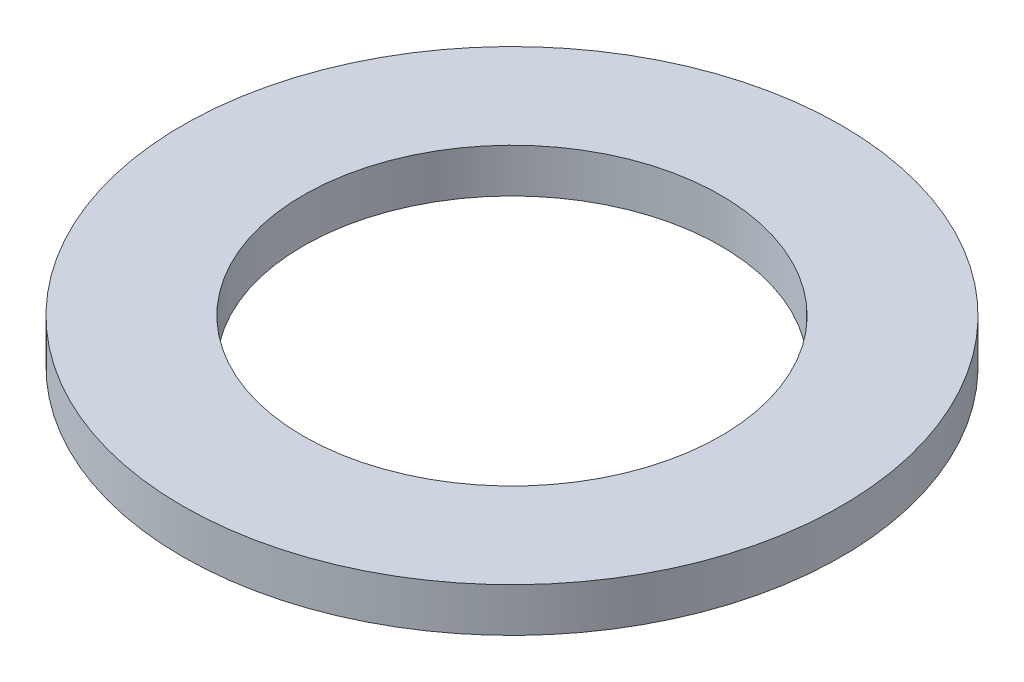
ISO-10303-21;
HEADER;
FILE_DESCRIPTION(('STEP AP214'),'2;1');
FILE_NAME('part.step','',(''),(''),'','','');
FILE_SCHEMA(('AUTOMOTIVE_DESIGN { 1 0 10303 214 1 1 1 1 }'));
ENDSEC;
DATA;
#1=APPLICATION_CONTEXT('core data for automotive mechanical design processes');
#2=APPLICATION_PROTOCOL_DEFINITION('international standard','automotive_design',2000,#1);
#3=PRODUCT_CONTEXT('',#1,'mechanical');
#4=PRODUCT('Part','Part','',(#3));
#5=PRODUCT_RELATED_PRODUCT_CATEGORY('part','',(#4));
#6=PRODUCT_DEFINITION_FORMATION('','',#4);
#7=PRODUCT_DEFINITION_CONTEXT('part definition',#1,'design');
#8=PRODUCT_DEFINITION('design','',#6,#7);
#9=PRODUCT_DEFINITION_SHAPE('','',#8);
#10=(LENGTH_UNIT() NAMED_UNIT(*) SI_UNIT(.MILLI.,.METRE.));
#11=(NAMED_UNIT(*) PLANE_ANGLE_UNIT() SI_UNIT($,.RADIAN.));
#12=(NAMED_UNIT(*) SI_UNIT($,.STERADIAN.) SOLID_ANGLE_UNIT());
#13=UNCERTAINTY_MEASURE_WITH_UNIT(LENGTH_MEASURE(1.E-05),#10,'distance_accuracy_value','');
#14=(GEOMETRIC_REPRESENTATION_CONTEXT(3) GLOBAL_UNCERTAINTY_ASSIGNED_CONTEXT((#13)) GLOBAL_UNIT_ASSIGNED_CONTEXT((#10,
#11,#12)) REPRESENTATION_CONTEXT('',''));
#15=CARTESIAN_POINT('',(0.,0.,0.));
#16=DIRECTION('',(0.,0.,1.));
#17=DIRECTION('',(1.,0.,0.));
#18=AXIS2_PLACEMENT_3D('',#15,#16,#17);
#19=CARTESIAN_POINT('',(0.,2.,0.));
#20=DIRECTION('',(0.,1.,0.));
#21=DIRECTION('',(0.,0.,1.));
#22=AXIS2_PLACEMENT_3D('',#19,#20,#21);
#23=PLANE('',#22);
#24=CARTESIAN_POINT('',(0.,2.,0.));
#25=DIRECTION('',(0.,1.,0.));
#26=DIRECTION('',(0.,0.,1.));
#27=AXIS2_PLACEMENT_3D('',#24,#25,#26);
#28=CIRCLE('',#27,15.);
#29=CARTESIAN_POINT('',(0.,2.,15.));
#30=VERTEX_POINT('',#29);
#31=EDGE_CURVE('E10',#30,#30,#28,.T.);
#32=ORIENTED_EDGE('',*,*,#31,.T.);
#33=EDGE_LOOP('',(#32));
#34=FACE_BOUND('',#33,.T.);
#35=CARTESIAN_POINT('',(0.,2.,0.));
#36=DIRECTION('',(0.,1.,0.));
#37=DIRECTION('',(0.,0.,1.));
#38=AXIS2_PLACEMENT_3D('',#35,#36,#37);
#39=CIRCLE('',#38,9.5);
#40=CARTESIAN_POINT('',(0.,2.,9.5));
#41=VERTEX_POINT('',#40);
#42=EDGE_CURVE('E54',#41,#41,#39,.T.);
#43=ORIENTED_EDGE('',*,*,#42,.F.);
#44=EDGE_LOOP('',(#43));
#45=FACE_BOUND('',#44,.T.);
#46=ADVANCED_FACE('F41',(#34,#45),#23,.T.);
#47=CARTESIAN_POINT('',(0.,0.,0.));
#48=DIRECTION('',(0.,1.,0.));
#49=DIRECTION('',(0.,0.,1.));
#50=AXIS2_PLACEMENT_3D('',#47,#48,#49);
#51=PLANE('',#50);
#52=CARTESIAN_POINT('',(0.,0.,0.));
#53=DIRECTION('',(0.,1.,0.));
#54=DIRECTION('',(0.,0.,1.));
#55=AXIS2_PLACEMENT_3D('',#52,#53,#54);
#56=CIRCLE('',#55,15.);
#57=CARTESIAN_POINT('',(0.,0.,15.));
#58=VERTEX_POINT('',#57);
#59=EDGE_CURVE('E45',#58,#58,#56,.T.);
#60=ORIENTED_EDGE('',*,*,#59,.F.);
#61=EDGE_LOOP('',(#60));
#62=FACE_BOUND('',#61,.T.);
#63=CARTESIAN_POINT('',(0.,0.,0.));
#64=DIRECTION('',(0.,1.,0.));
#65=DIRECTION('',(0.,0.,1.));
#66=AXIS2_PLACEMENT_3D('',#63,#64,#65);
#67=CIRCLE('',#66,9.5);
#68=CARTESIAN_POINT('',(0.,0.,9.5));
#69=VERTEX_POINT('',#68);
#70=EDGE_CURVE('E56',#69,#69,#67,.T.);
#71=ORIENTED_EDGE('',*,*,#70,.T.);
#72=EDGE_LOOP('',(#71));
#73=FACE_BOUND('',#72,.T.);
#74=ADVANCED_FACE('F68',(#62,#73),#51,.F.);
#75=CARTESIAN_POINT('',(0.,2.,0.));
#76=DIRECTION('',(0.,-1.,0.));
#77=DIRECTION('',(0.,0.,-1.));
#78=AXIS2_PLACEMENT_3D('',#75,#76,#77);
#79=CYLINDRICAL_SURFACE('',#78,15.);
#80=ORIENTED_EDGE('',*,*,#31,.F.);
#81=EDGE_LOOP('',(#80));
#82=FACE_BOUND('',#81,.T.);
#83=ORIENTED_EDGE('',*,*,#59,.T.);
#84=EDGE_LOOP('',(#83));
#85=FACE_BOUND('',#84,.T.);
#86=ADVANCED_FACE('F43',(#82,#85),#79,.T.);
#87=CARTESIAN_POINT('',(0.,2.,0.));
#88=DIRECTION('',(0.,-1.,0.));
#89=DIRECTION('',(0.,0.,-1.));
#90=AXIS2_PLACEMENT_3D('',#87,#88,#89);
#91=CYLINDRICAL_SURFACE('',#90,9.5);
#92=ORIENTED_EDGE('',*,*,#42,.T.);
#93=EDGE_LOOP('',(#92));
#94=FACE_BOUND('',#93,.T.);
#95=ORIENTED_EDGE('',*,*,#70,.F.);
#96=EDGE_LOOP('',(#95));
#97=FACE_BOUND('',#96,.T.);
#98=ADVANCED_FACE('F64',(#94,#97),#91,.F.);
#99=CLOSED_SHELL('',(#46,#74,#86,#98));
#100=MANIFOLD_SOLID_BREP('B2',#99);
#101=ADVANCED_BREP_SHAPE_REPRESENTATION('',(#18,#100),#14);
#102=SHAPE_DEFINITION_REPRESENTATION(#9,#101);
ENDSEC;
END-ISO-10303-21;
